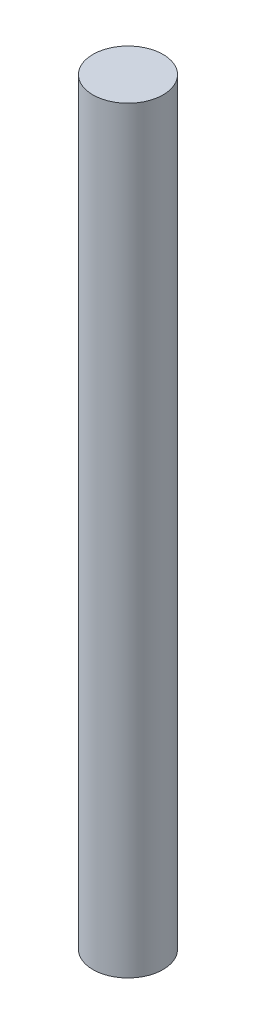
ISO-10303-21;
HEADER;
FILE_DESCRIPTION(('STEP AP214'),'2;1');
FILE_NAME('part.step','',(''),(''),'','','');
FILE_SCHEMA(('AUTOMOTIVE_DESIGN { 1 0 10303 214 1 1 1 1 }'));
ENDSEC;
DATA;
#1=APPLICATION_CONTEXT('core data for automotive mechanical design processes');
#2=APPLICATION_PROTOCOL_DEFINITION('international standard','automotive_design',2000,#1);
#3=PRODUCT_CONTEXT('',#1,'mechanical');
#4=PRODUCT('Part','Part','',(#3));
#5=PRODUCT_RELATED_PRODUCT_CATEGORY('part','',(#4));
#6=PRODUCT_DEFINITION_FORMATION('','',#4);
#7=PRODUCT_DEFINITION_CONTEXT('part definition',#1,'design');
#8=PRODUCT_DEFINITION('design','',#6,#7);
#9=PRODUCT_DEFINITION_SHAPE('','',#8);
#10=(LENGTH_UNIT() NAMED_UNIT(*) SI_UNIT(.MILLI.,.METRE.));
#11=(NAMED_UNIT(*) PLANE_ANGLE_UNIT() SI_UNIT($,.RADIAN.));
#12=(NAMED_UNIT(*) SI_UNIT($,.STERADIAN.) SOLID_ANGLE_UNIT());
#13=UNCERTAINTY_MEASURE_WITH_UNIT(LENGTH_MEASURE(1.E-05),#10,'distance_accuracy_value','');
#14=(GEOMETRIC_REPRESENTATION_CONTEXT(3) GLOBAL_UNCERTAINTY_ASSIGNED_CONTEXT((#13)) GLOBAL_UNIT_ASSIGNED_CONTEXT((#10,
#11,#12)) REPRESENTATION_CONTEXT('',''));
#15=CARTESIAN_POINT('',(0.,0.,0.));
#16=DIRECTION('',(0.,0.,1.));
#17=DIRECTION('',(1.,0.,0.));
#18=AXIS2_PLACEMENT_3D('',#15,#16,#17);
#19=CARTESIAN_POINT('',(0.,68.58,0.));
#20=DIRECTION('',(0.,-1.,0.));
#21=DIRECTION('',(0.,0.,-1.));
#22=AXIS2_PLACEMENT_3D('',#19,#20,#21);
#23=CYLINDRICAL_SURFACE('',#22,3.175);
#24=CARTESIAN_POINT('',(0.,68.58,0.));
#25=DIRECTION('',(0.,1.,0.));
#26=DIRECTION('',(0.,0.,1.));
#27=AXIS2_PLACEMENT_3D('',#24,#25,#26);
#28=CIRCLE('',#27,3.175);
#29=CARTESIAN_POINT('',(0.,68.58,3.175));
#30=VERTEX_POINT('',#29);
#31=EDGE_CURVE('E10',#30,#30,#28,.T.);
#32=ORIENTED_EDGE('',*,*,#31,.F.);
#33=EDGE_LOOP('',(#32));
#34=FACE_BOUND('',#33,.T.);
#35=CARTESIAN_POINT('',(0.,0.,0.));
#36=DIRECTION('',(0.,1.,0.));
#37=DIRECTION('',(0.,0.,1.));
#38=AXIS2_PLACEMENT_3D('',#35,#36,#37);
#39=CIRCLE('',#38,3.175);
#40=CARTESIAN_POINT('',(0.,0.,3.175));
#41=VERTEX_POINT('',#40);
#42=EDGE_CURVE('E38',#41,#41,#39,.T.);
#43=ORIENTED_EDGE('',*,*,#42,.T.);
#44=EDGE_LOOP('',(#43));
#45=FACE_BOUND('',#44,.T.);
#46=ADVANCED_FACE('F35',(#34,#45),#23,.T.);
#47=CARTESIAN_POINT('',(0.,68.58,0.));
#48=DIRECTION('',(0.,1.,0.));
#49=DIRECTION('',(0.,0.,1.));
#50=AXIS2_PLACEMENT_3D('',#47,#48,#49);
#51=PLANE('',#50);
#52=ORIENTED_EDGE('',*,*,#31,.T.);
#53=EDGE_LOOP('',(#52));
#54=FACE_BOUND('',#53,.T.);
#55=ADVANCED_FACE('F50',(#54),#51,.T.);
#56=CARTESIAN_POINT('',(0.,0.,0.));
#57=DIRECTION('',(0.,1.,0.));
#58=DIRECTION('',(0.,0.,1.));
#59=AXIS2_PLACEMENT_3D('',#56,#57,#58);
#60=PLANE('',#59);
#61=ORIENTED_EDGE('',*,*,#42,.F.);
#62=EDGE_LOOP('',(#61));
#63=FACE_BOUND('',#62,.T.);
#64=ADVANCED_FACE('F48',(#63),#60,.F.);
#65=CLOSED_SHELL('',(#46,#55,#64));
#66=MANIFOLD_SOLID_BREP('B2',#65);
#67=ADVANCED_BREP_SHAPE_REPRESENTATION('',(#18,#66),#14);
#68=SHAPE_DEFINITION_REPRESENTATION(#9,#67);
ENDSEC;
END-ISO-10303-21;
